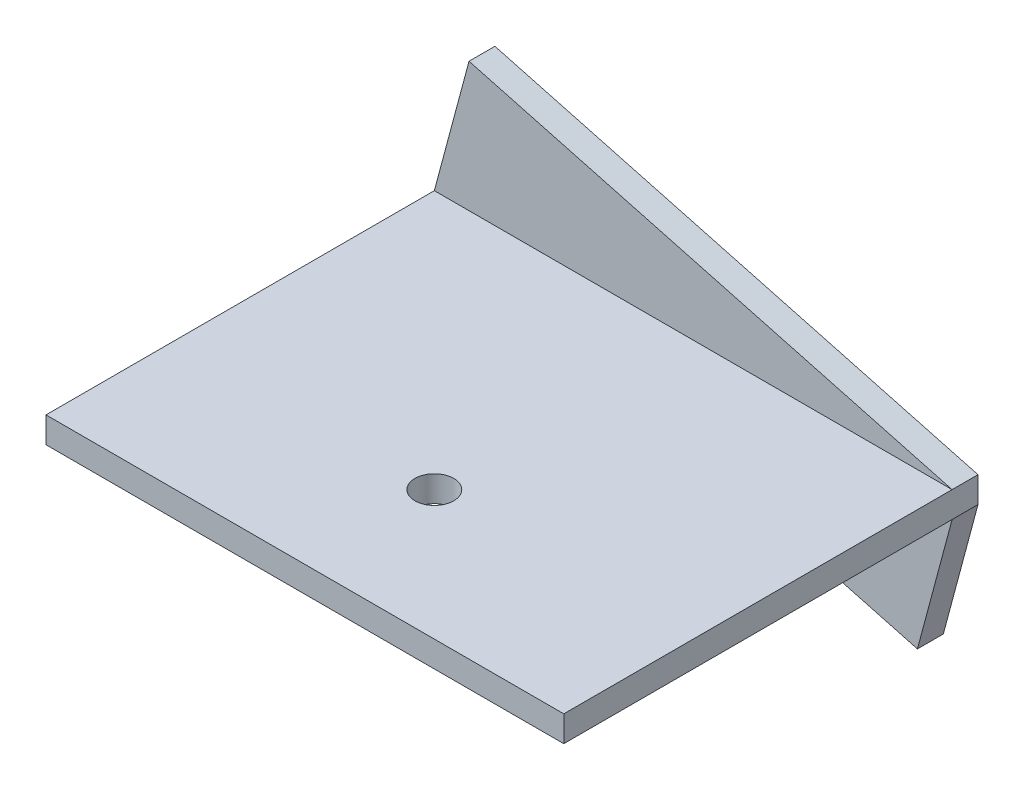
ISO-10303-21;
HEADER;
FILE_DESCRIPTION(('STEP AP214'),'2;1');
FILE_NAME('part.step','',(''),(''),'','','');
FILE_SCHEMA(('AUTOMOTIVE_DESIGN { 1 0 10303 214 1 1 1 1 }'));
ENDSEC;
DATA;
#1=APPLICATION_CONTEXT('core data for automotive mechanical design processes');
#2=APPLICATION_PROTOCOL_DEFINITION('international standard','automotive_design',2000,#1);
#3=PRODUCT_CONTEXT('',#1,'mechanical');
#4=PRODUCT('Part','Part','',(#3));
#5=PRODUCT_RELATED_PRODUCT_CATEGORY('part','',(#4));
#6=PRODUCT_DEFINITION_FORMATION('','',#4);
#7=PRODUCT_DEFINITION_CONTEXT('part definition',#1,'design');
#8=PRODUCT_DEFINITION('design','',#6,#7);
#9=PRODUCT_DEFINITION_SHAPE('','',#8);
#10=(LENGTH_UNIT() NAMED_UNIT(*) SI_UNIT(.MILLI.,.METRE.));
#11=(NAMED_UNIT(*) PLANE_ANGLE_UNIT() SI_UNIT($,.RADIAN.));
#12=(NAMED_UNIT(*) SI_UNIT($,.STERADIAN.) SOLID_ANGLE_UNIT());
#13=UNCERTAINTY_MEASURE_WITH_UNIT(LENGTH_MEASURE(1.E-05),#10,'distance_accuracy_value','');
#14=(GEOMETRIC_REPRESENTATION_CONTEXT(3) GLOBAL_UNCERTAINTY_ASSIGNED_CONTEXT((#13)) GLOBAL_UNIT_ASSIGNED_CONTEXT((#10,
#11,#12)) REPRESENTATION_CONTEXT('',''));
#15=CARTESIAN_POINT('',(0.,0.,0.));
#16=DIRECTION('',(0.,0.,1.));
#17=DIRECTION('',(1.,0.,0.));
#18=AXIS2_PLACEMENT_3D('',#15,#16,#17);
#19=CARTESIAN_POINT('',(0.,4.,0.));
#20=DIRECTION('',(0.,1.,0.));
#21=DIRECTION('',(0.,0.,1.));
#22=AXIS2_PLACEMENT_3D('',#19,#20,#21);
#23=PLANE('',#22);
#24=CARTESIAN_POINT('',(0.,4.,9.99999999999999));
#25=DIRECTION('',(0.,1.,0.));
#26=DIRECTION('',(0.,0.,1.));
#27=AXIS2_PLACEMENT_3D('',#24,#25,#26);
#28=CIRCLE('',#27,3.);
#29=CARTESIAN_POINT('',(0.,4.,13.));
#30=VERTEX_POINT('',#29);
#31=EDGE_CURVE('E165',#30,#30,#28,.T.);
#32=ORIENTED_EDGE('',*,*,#31,.F.);
#33=EDGE_LOOP('',(#32));
#34=FACE_BOUND('',#33,.T.);
#35=DIRECTION('',(0.,0.,-1.));
#36=VECTOR('',#35,1.);
#37=CARTESIAN_POINT('',(40.,4.,-30.));
#38=LINE('',#37,#36);
#39=CARTESIAN_POINT('',(40.,4.,30.));
#40=VERTEX_POINT('',#39);
#41=CARTESIAN_POINT('',(40.,4.,-30.));
#42=VERTEX_POINT('',#41);
#43=EDGE_CURVE('E174',#40,#42,#38,.T.);
#44=ORIENTED_EDGE('',*,*,#43,.T.);
#45=DIRECTION('',(-1.,0.,0.));
#46=VECTOR('',#45,1.);
#47=CARTESIAN_POINT('',(-40.,4.,-30.));
#48=LINE('',#47,#46);
#49=CARTESIAN_POINT('',(-40.,4.,-30.));
#50=VERTEX_POINT('',#49);
#51=EDGE_CURVE('E144',#42,#50,#48,.T.);
#52=ORIENTED_EDGE('',*,*,#51,.T.);
#53=DIRECTION('',(0.,0.,1.));
#54=VECTOR('',#53,1.);
#55=CARTESIAN_POINT('',(-40.,4.,-30.));
#56=LINE('',#55,#54);
#57=CARTESIAN_POINT('',(-40.,4.,30.));
#58=VERTEX_POINT('',#57);
#59=EDGE_CURVE('E178',#50,#58,#56,.T.);
#60=ORIENTED_EDGE('',*,*,#59,.T.);
#61=DIRECTION('',(1.,0.,0.));
#62=VECTOR('',#61,1.);
#63=CARTESIAN_POINT('',(-40.,4.,30.));
#64=LINE('',#63,#62);
#65=EDGE_CURVE('E182',#58,#40,#64,.T.);
#66=ORIENTED_EDGE('',*,*,#65,.T.);
#67=EDGE_LOOP('',(#44,#52,#60,#66));
#68=FACE_BOUND('',#67,.T.);
#69=ADVANCED_FACE('F39',(#34,#68),#23,.T.);
#70=CARTESIAN_POINT('',(40.,4.,-30.));
#71=DIRECTION('',(-1.,0.,0.));
#72=DIRECTION('',(0.,0.,1.));
#73=AXIS2_PLACEMENT_3D('',#70,#71,#72);
#74=PLANE('',#73);
#75=DIRECTION('',(0.,0.,-1.));
#76=VECTOR('',#75,1.);
#77=CARTESIAN_POINT('',(40.,0.,-30.));
#78=LINE('',#77,#76);
#79=CARTESIAN_POINT('',(40.,0.,30.));
#80=VERTEX_POINT('',#79);
#81=CARTESIAN_POINT('',(40.,0.,-30.));
#82=VERTEX_POINT('',#81);
#83=EDGE_CURVE('E170',#80,#82,#78,.T.);
#84=ORIENTED_EDGE('',*,*,#83,.T.);
#85=DIRECTION('',(0.,0.,1.));
#86=VECTOR('',#85,1.);
#87=CARTESIAN_POINT('',(40.,0.,-84.));
#88=LINE('',#87,#86);
#89=CARTESIAN_POINT('',(40.,0.,-34.));
#90=VERTEX_POINT('',#89);
#91=EDGE_CURVE('E121',#90,#82,#88,.T.);
#92=ORIENTED_EDGE('',*,*,#91,.F.);
#93=DIRECTION('',(0.,1.,0.));
#94=VECTOR('',#93,1.);
#95=CARTESIAN_POINT('',(40.,-50.,-34.));
#96=LINE('',#95,#94);
#97=CARTESIAN_POINT('',(40.,4.,-34.));
#98=VERTEX_POINT('',#97);
#99=EDGE_CURVE('E159',#90,#98,#96,.T.);
#100=ORIENTED_EDGE('',*,*,#99,.T.);
#101=DIRECTION('',(0.,0.,1.));
#102=VECTOR('',#101,1.);
#103=CARTESIAN_POINT('',(40.,4.,-34.));
#104=LINE('',#103,#102);
#105=EDGE_CURVE('E149',#98,#42,#104,.T.);
#106=ORIENTED_EDGE('',*,*,#105,.T.);
#107=ORIENTED_EDGE('',*,*,#43,.F.);
#108=DIRECTION('',(0.,-1.,0.));
#109=VECTOR('',#108,1.);
#110=CARTESIAN_POINT('',(40.,4.,30.));
#111=LINE('',#110,#109);
#112=EDGE_CURVE('E185',#40,#80,#111,.T.);
#113=ORIENTED_EDGE('',*,*,#112,.T.);
#114=EDGE_LOOP('',(#84,#92,#100,#106,#107,#113));
#115=FACE_BOUND('',#114,.T.);
#116=ADVANCED_FACE('F41',(#115),#74,.F.);
#117=CARTESIAN_POINT('',(-40.,4.,-30.));
#118=DIRECTION('',(1.,0.,0.));
#119=DIRECTION('',(0.,0.,-1.));
#120=AXIS2_PLACEMENT_3D('',#117,#118,#119);
#121=PLANE('',#120);
#122=DIRECTION('',(0.,1.,0.));
#123=VECTOR('',#122,1.);
#124=CARTESIAN_POINT('',(-40.,-50.,-34.));
#125=LINE('',#124,#123);
#126=CARTESIAN_POINT('',(-40.,0.,-34.));
#127=VERTEX_POINT('',#126);
#128=CARTESIAN_POINT('',(-40.,4.,-34.));
#129=VERTEX_POINT('',#128);
#130=EDGE_CURVE('E162',#127,#129,#125,.T.);
#131=ORIENTED_EDGE('',*,*,#130,.F.);
#132=DIRECTION('',(0.,0.,1.));
#133=VECTOR('',#132,1.);
#134=CARTESIAN_POINT('',(-40.,0.,-84.));
#135=LINE('',#134,#133);
#136=CARTESIAN_POINT('',(-40.,0.,-30.));
#137=VERTEX_POINT('',#136);
#138=EDGE_CURVE('E117',#127,#137,#135,.T.);
#139=ORIENTED_EDGE('',*,*,#138,.T.);
#140=DIRECTION('',(0.,0.,1.));
#141=VECTOR('',#140,1.);
#142=CARTESIAN_POINT('',(-40.,0.,-30.));
#143=LINE('',#142,#141);
#144=CARTESIAN_POINT('',(-40.,0.,30.));
#145=VERTEX_POINT('',#144);
#146=EDGE_CURVE('E191',#137,#145,#143,.T.);
#147=ORIENTED_EDGE('',*,*,#146,.T.);
#148=DIRECTION('',(0.,-1.,0.));
#149=VECTOR('',#148,1.);
#150=CARTESIAN_POINT('',(-40.,4.,30.));
#151=LINE('',#150,#149);
#152=EDGE_CURVE('E48',#58,#145,#151,.T.);
#153=ORIENTED_EDGE('',*,*,#152,.F.);
#154=ORIENTED_EDGE('',*,*,#59,.F.);
#155=EDGE_CURVE('E62',#129,#50,#56,.T.);
#156=ORIENTED_EDGE('',*,*,#155,.F.);
#157=EDGE_LOOP('',(#131,#139,#147,#153,#154,#156));
#158=FACE_BOUND('',#157,.T.);
#159=ADVANCED_FACE('F220',(#158),#121,.F.);
#160=CARTESIAN_POINT('',(-40.,4.,30.));
#161=DIRECTION('',(0.,0.,-1.));
#162=DIRECTION('',(-1.,0.,0.));
#163=AXIS2_PLACEMENT_3D('',#160,#161,#162);
#164=PLANE('',#163);
#165=DIRECTION('',(1.,0.,0.));
#166=VECTOR('',#165,1.);
#167=CARTESIAN_POINT('',(-40.,0.,30.));
#168=LINE('',#167,#166);
#169=EDGE_CURVE('E179',#145,#80,#168,.T.);
#170=ORIENTED_EDGE('',*,*,#169,.T.);
#171=ORIENTED_EDGE('',*,*,#112,.F.);
#172=ORIENTED_EDGE('',*,*,#65,.F.);
#173=ORIENTED_EDGE('',*,*,#152,.T.);
#174=EDGE_LOOP('',(#170,#171,#172,#173));
#175=FACE_BOUND('',#174,.T.);
#176=ADVANCED_FACE('F204',(#175),#164,.F.);
#177=CARTESIAN_POINT('',(0.,0.,0.));
#178=DIRECTION('',(0.,1.,0.));
#179=DIRECTION('',(0.,0.,1.));
#180=AXIS2_PLACEMENT_3D('',#177,#178,#179);
#181=PLANE('',#180);
#182=CARTESIAN_POINT('',(0.,0.,9.99999999999999));
#183=DIRECTION('',(0.,1.,0.));
#184=DIRECTION('',(0.,0.,1.));
#185=AXIS2_PLACEMENT_3D('',#182,#183,#184);
#186=CIRCLE('',#185,3.);
#187=CARTESIAN_POINT('',(0.,0.,13.));
#188=VERTEX_POINT('',#187);
#189=EDGE_CURVE('E166',#188,#188,#186,.T.);
#190=ORIENTED_EDGE('',*,*,#189,.T.);
#191=EDGE_LOOP('',(#190));
#192=FACE_BOUND('',#191,.T.);
#193=ORIENTED_EDGE('',*,*,#83,.F.);
#194=ORIENTED_EDGE('',*,*,#169,.F.);
#195=ORIENTED_EDGE('',*,*,#146,.F.);
#196=DIRECTION('',(-1.,0.,0.));
#197=VECTOR('',#196,1.);
#198=CARTESIAN_POINT('',(-40.,0.,-30.));
#199=LINE('',#198,#197);
#200=EDGE_CURVE('E115',#82,#137,#199,.T.);
#201=ORIENTED_EDGE('',*,*,#200,.F.);
#202=EDGE_LOOP('',(#193,#194,#195,#201));
#203=FACE_BOUND('',#202,.T.);
#204=ADVANCED_FACE('F211',(#192,#203),#181,.F.);
#205=CARTESIAN_POINT('',(0.,0.,9.99999999999999));
#206=DIRECTION('',(0.,1.,0.));
#207=DIRECTION('',(0.,0.,1.));
#208=AXIS2_PLACEMENT_3D('',#205,#206,#207);
#209=CYLINDRICAL_SURFACE('',#208,3.);
#210=ORIENTED_EDGE('',*,*,#189,.F.);
#211=EDGE_LOOP('',(#210));
#212=FACE_BOUND('',#211,.T.);
#213=ORIENTED_EDGE('',*,*,#31,.T.);
#214=EDGE_LOOP('',(#213));
#215=FACE_BOUND('',#214,.T.);
#216=ADVANCED_FACE('F247',(#212,#215),#209,.F.);
#217=CARTESIAN_POINT('',(40.,-50.,-30.));
#218=DIRECTION('',(0.,0.,-1.));
#219=DIRECTION('',(-1.,0.,0.));
#220=AXIS2_PLACEMENT_3D('',#217,#218,#219);
#221=PLANE('',#220);
#222=ORIENTED_EDGE('',*,*,#200,.T.);
#223=DIRECTION('',(-0.965925826289067,0.258819045102525,0.));
#224=VECTOR('',#223,1.);
#225=CARTESIAN_POINT('',(-40.,0.,-30.));
#226=LINE('',#225,#224);
#227=CARTESIAN_POINT('',(34.6410161513774,-20.0000000000003,-30.));
#228=VERTEX_POINT('',#227);
#229=EDGE_CURVE('E104',#228,#137,#226,.T.);
#230=ORIENTED_EDGE('',*,*,#229,.F.);
#231=DIRECTION('',(-0.258819045102525,-0.965925826289067,0.));
#232=VECTOR('',#231,1.);
#233=CARTESIAN_POINT('',(40.,0.,-30.));
#234=LINE('',#233,#232);
#235=EDGE_CURVE('E113',#82,#228,#234,.T.);
#236=ORIENTED_EDGE('',*,*,#235,.F.);
#237=EDGE_LOOP('',(#222,#230,#236));
#238=FACE_BOUND('',#237,.T.);
#239=ADVANCED_FACE('F112',(#238),#221,.F.);
#240=CARTESIAN_POINT('',(40.,-50.,-34.));
#241=DIRECTION('',(0.,0.,1.));
#242=DIRECTION('',(1.,0.,0.));
#243=AXIS2_PLACEMENT_3D('',#240,#241,#242);
#244=PLANE('',#243);
#245=DIRECTION('',(-0.258819045102525,-0.965925826289067,0.));
#246=VECTOR('',#245,1.);
#247=CARTESIAN_POINT('',(27.4999999999998,-46.6506350946109,-34.));
#248=LINE('',#247,#246);
#249=CARTESIAN_POINT('',(34.6410161513774,-20.0000000000003,-34.));
#250=VERTEX_POINT('',#249);
#251=EDGE_CURVE('E126',#90,#250,#248,.T.);
#252=ORIENTED_EDGE('',*,*,#251,.T.);
#253=DIRECTION('',(-0.965925826289067,0.258819045102525,0.));
#254=VECTOR('',#253,1.);
#255=CARTESIAN_POINT('',(47.1410161513776,-23.3493649053894,-34.));
#256=LINE('',#255,#254);
#257=EDGE_CURVE('E55',#250,#127,#256,.T.);
#258=ORIENTED_EDGE('',*,*,#257,.T.);
#259=ORIENTED_EDGE('',*,*,#130,.T.);
#260=DIRECTION('',(0.258819045102528,0.965925826289067,0.));
#261=VECTOR('',#260,1.);
#262=CARTESIAN_POINT('',(-48.1410161513776,-26.3826859021792,-34.));
#263=LINE('',#262,#261);
#264=CARTESIAN_POINT('',(-34.6410161513774,24.,-34.));
#265=VERTEX_POINT('',#264);
#266=EDGE_CURVE('E140',#129,#265,#263,.T.);
#267=ORIENTED_EDGE('',*,*,#266,.T.);
#268=DIRECTION('',(0.965925826289068,-0.258819045102522,0.));
#269=VECTOR('',#268,1.);
#270=CARTESIAN_POINT('',(40.,4.,-34.));
#271=LINE('',#270,#269);
#272=EDGE_CURVE('E145',#265,#98,#271,.T.);
#273=ORIENTED_EDGE('',*,*,#272,.T.);
#274=ORIENTED_EDGE('',*,*,#99,.F.);
#275=EDGE_LOOP('',(#252,#258,#259,#267,#273,#274));
#276=FACE_BOUND('',#275,.T.);
#277=ADVANCED_FACE('F222',(#276),#244,.F.);
#278=CARTESIAN_POINT('',(40.,4.,-34.));
#279=DIRECTION('',(-0.258819045102522,-0.965925826289068,0.));
#280=DIRECTION('',(0.965925826289068,-0.258819045102522,0.));
#281=AXIS2_PLACEMENT_3D('',#278,#279,#280);
#282=PLANE('',#281);
#283=ORIENTED_EDGE('',*,*,#272,.F.);
#284=DIRECTION('',(0.,0.,1.));
#285=VECTOR('',#284,1.);
#286=CARTESIAN_POINT('',(-34.6410161513774,24.,-84.));
#287=LINE('',#286,#285);
#288=CARTESIAN_POINT('',(-34.6410161513774,24.,-30.));
#289=VERTEX_POINT('',#288);
#290=EDGE_CURVE('E136',#265,#289,#287,.T.);
#291=ORIENTED_EDGE('',*,*,#290,.T.);
#292=DIRECTION('',(0.965925826289068,-0.258819045102522,0.));
#293=VECTOR('',#292,1.);
#294=CARTESIAN_POINT('',(40.,4.,-30.));
#295=LINE('',#294,#293);
#296=EDGE_CURVE('E150',#289,#42,#295,.T.);
#297=ORIENTED_EDGE('',*,*,#296,.T.);
#298=ORIENTED_EDGE('',*,*,#105,.F.);
#299=EDGE_LOOP('',(#283,#291,#297,#298));
#300=FACE_BOUND('',#299,.T.);
#301=ADVANCED_FACE('F227',(#300),#282,.F.);
#302=CARTESIAN_POINT('',(40.,4.,-30.));
#303=DIRECTION('',(0.,0.,-1.));
#304=DIRECTION('',(-1.,0.,0.));
#305=AXIS2_PLACEMENT_3D('',#302,#303,#304);
#306=PLANE('',#305);
#307=ORIENTED_EDGE('',*,*,#296,.F.);
#308=DIRECTION('',(0.258819045102528,0.965925826289067,0.));
#309=VECTOR('',#308,1.);
#310=CARTESIAN_POINT('',(-40.,4.,-30.));
#311=LINE('',#310,#309);
#312=EDGE_CURVE('E133',#50,#289,#311,.T.);
#313=ORIENTED_EDGE('',*,*,#312,.F.);
#314=ORIENTED_EDGE('',*,*,#51,.F.);
#315=EDGE_LOOP('',(#307,#313,#314));
#316=FACE_BOUND('',#315,.T.);
#317=ADVANCED_FACE('F229',(#316),#306,.F.);
#318=CARTESIAN_POINT('',(-40.,4.,-84.));
#319=DIRECTION('',(0.965925826289067,-0.258819045102528,0.));
#320=DIRECTION('',(0.258819045102528,0.965925826289067,0.));
#321=AXIS2_PLACEMENT_3D('',#318,#319,#320);
#322=PLANE('',#321);
#323=ORIENTED_EDGE('',*,*,#155,.T.);
#324=ORIENTED_EDGE('',*,*,#312,.T.);
#325=ORIENTED_EDGE('',*,*,#290,.F.);
#326=ORIENTED_EDGE('',*,*,#266,.F.);
#327=EDGE_LOOP('',(#323,#324,#325,#326));
#328=FACE_BOUND('',#327,.T.);
#329=ADVANCED_FACE('F224',(#328),#322,.F.);
#330=CARTESIAN_POINT('',(40.,0.,-84.));
#331=DIRECTION('',(-0.965925826289067,0.258819045102525,0.));
#332=DIRECTION('',(-0.258819045102525,-0.965925826289067,0.));
#333=AXIS2_PLACEMENT_3D('',#330,#331,#332);
#334=PLANE('',#333);
#335=ORIENTED_EDGE('',*,*,#235,.T.);
#336=DIRECTION('',(0.,0.,-1.));
#337=VECTOR('',#336,1.);
#338=CARTESIAN_POINT('',(34.6410161513774,-20.0000000000003,-84.));
#339=LINE('',#338,#337);
#340=EDGE_CURVE('E11',#228,#250,#339,.T.);
#341=ORIENTED_EDGE('',*,*,#340,.T.);
#342=ORIENTED_EDGE('',*,*,#251,.F.);
#343=ORIENTED_EDGE('',*,*,#91,.T.);
#344=EDGE_LOOP('',(#335,#341,#342,#343));
#345=FACE_BOUND('',#344,.T.);
#346=ADVANCED_FACE('F119',(#345),#334,.F.);
#347=CARTESIAN_POINT('',(-40.,0.,-84.));
#348=DIRECTION('',(0.258819045102525,0.965925826289067,0.));
#349=DIRECTION('',(-0.965925826289067,0.258819045102525,0.));
#350=AXIS2_PLACEMENT_3D('',#347,#348,#349);
#351=PLANE('',#350);
#352=ORIENTED_EDGE('',*,*,#340,.F.);
#353=ORIENTED_EDGE('',*,*,#229,.T.);
#354=ORIENTED_EDGE('',*,*,#138,.F.);
#355=ORIENTED_EDGE('',*,*,#257,.F.);
#356=EDGE_LOOP('',(#352,#353,#354,#355));
#357=FACE_BOUND('',#356,.T.);
#358=ADVANCED_FACE('F103',(#357),#351,.F.);
#359=CLOSED_SHELL('',(#69,#116,#159,#176,#204,#216,#239,#277,#301,#317,#329,#346,#358));
#360=MANIFOLD_SOLID_BREP('B2',#359);
#361=ADVANCED_BREP_SHAPE_REPRESENTATION('',(#18,#360),#14);
#362=SHAPE_DEFINITION_REPRESENTATION(#9,#361);
ENDSEC;
END-ISO-10303-21;
